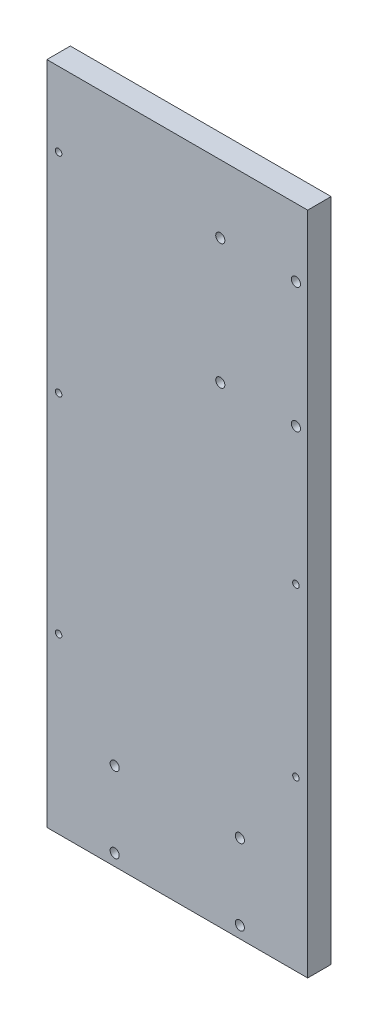
ISO-10303-21;
HEADER;
FILE_DESCRIPTION(('STEP AP214'),'2;1');
FILE_NAME('part.step','',(''),(''),'','','');
FILE_SCHEMA(('AUTOMOTIVE_DESIGN { 1 0 10303 214 1 1 1 1 }'));
ENDSEC;
DATA;
#1=APPLICATION_CONTEXT('core data for automotive mechanical design processes');
#2=APPLICATION_PROTOCOL_DEFINITION('international standard','automotive_design',2000,#1);
#3=PRODUCT_CONTEXT('',#1,'mechanical');
#4=PRODUCT('Part','Part','',(#3));
#5=PRODUCT_RELATED_PRODUCT_CATEGORY('part','',(#4));
#6=PRODUCT_DEFINITION_FORMATION('','',#4);
#7=PRODUCT_DEFINITION_CONTEXT('part definition',#1,'design');
#8=PRODUCT_DEFINITION('design','',#6,#7);
#9=PRODUCT_DEFINITION_SHAPE('','',#8);
#10=(LENGTH_UNIT() NAMED_UNIT(*) SI_UNIT(.MILLI.,.METRE.));
#11=(NAMED_UNIT(*) PLANE_ANGLE_UNIT() SI_UNIT($,.RADIAN.));
#12=(NAMED_UNIT(*) SI_UNIT($,.STERADIAN.) SOLID_ANGLE_UNIT());
#13=UNCERTAINTY_MEASURE_WITH_UNIT(LENGTH_MEASURE(1.E-05),#10,'distance_accuracy_value','');
#14=(GEOMETRIC_REPRESENTATION_CONTEXT(3) GLOBAL_UNCERTAINTY_ASSIGNED_CONTEXT((#13)) GLOBAL_UNIT_ASSIGNED_CONTEXT((#10,
#11,#12)) REPRESENTATION_CONTEXT('',''));
#15=CARTESIAN_POINT('',(0.,0.,0.));
#16=DIRECTION('',(0.,0.,1.));
#17=DIRECTION('',(1.,0.,0.));
#18=AXIS2_PLACEMENT_3D('',#15,#16,#17);
#19=CARTESIAN_POINT('',(100.,255.,18.));
#20=DIRECTION('',(-1.,0.,0.));
#21=DIRECTION('',(0.,-1.,0.));
#22=AXIS2_PLACEMENT_3D('',#19,#20,#21);
#23=PLANE('',#22);
#24=DIRECTION('',(0.,1.,0.));
#25=VECTOR('',#24,1.);
#26=CARTESIAN_POINT('',(100.,255.,0.));
#27=LINE('',#26,#25);
#28=CARTESIAN_POINT('',(100.,-255.,0.));
#29=VERTEX_POINT('',#28);
#30=CARTESIAN_POINT('',(100.,255.,0.));
#31=VERTEX_POINT('',#30);
#32=EDGE_CURVE('E95',#29,#31,#27,.T.);
#33=ORIENTED_EDGE('',*,*,#32,.T.);
#34=DIRECTION('',(0.,0.,-1.));
#35=VECTOR('',#34,1.);
#36=CARTESIAN_POINT('',(100.,255.,18.));
#37=LINE('',#36,#35);
#38=CARTESIAN_POINT('',(100.,255.,18.));
#39=VERTEX_POINT('',#38);
#40=EDGE_CURVE('E11',#39,#31,#37,.T.);
#41=ORIENTED_EDGE('',*,*,#40,.F.);
#42=DIRECTION('',(0.,1.,0.));
#43=VECTOR('',#42,1.);
#44=CARTESIAN_POINT('',(100.,255.,18.));
#45=LINE('',#44,#43);
#46=CARTESIAN_POINT('',(100.,-255.,18.));
#47=VERTEX_POINT('',#46);
#48=EDGE_CURVE('E83',#47,#39,#45,.T.);
#49=ORIENTED_EDGE('',*,*,#48,.F.);
#50=DIRECTION('',(0.,0.,-1.));
#51=VECTOR('',#50,1.);
#52=CARTESIAN_POINT('',(100.,-255.,18.));
#53=LINE('',#52,#51);
#54=EDGE_CURVE('E91',#47,#29,#53,.T.);
#55=ORIENTED_EDGE('',*,*,#54,.T.);
#56=EDGE_LOOP('',(#33,#41,#49,#55));
#57=FACE_BOUND('',#56,.T.);
#58=ADVANCED_FACE('F32',(#57),#23,.F.);
#59=CARTESIAN_POINT('',(-100.,255.,18.));
#60=DIRECTION('',(0.,-1.,0.));
#61=DIRECTION('',(0.,0.,-1.));
#62=AXIS2_PLACEMENT_3D('',#59,#60,#61);
#63=PLANE('',#62);
#64=DIRECTION('',(-1.,0.,0.));
#65=VECTOR('',#64,1.);
#66=CARTESIAN_POINT('',(-100.,255.,0.));
#67=LINE('',#66,#65);
#68=CARTESIAN_POINT('',(-100.,255.,0.));
#69=VERTEX_POINT('',#68);
#70=EDGE_CURVE('E87',#31,#69,#67,.T.);
#71=ORIENTED_EDGE('',*,*,#70,.T.);
#72=DIRECTION('',(0.,0.,-1.));
#73=VECTOR('',#72,1.);
#74=CARTESIAN_POINT('',(-100.,255.,18.));
#75=LINE('',#74,#73);
#76=CARTESIAN_POINT('',(-100.,255.,18.));
#77=VERTEX_POINT('',#76);
#78=EDGE_CURVE('E40',#77,#69,#75,.T.);
#79=ORIENTED_EDGE('',*,*,#78,.F.);
#80=DIRECTION('',(-1.,0.,0.));
#81=VECTOR('',#80,1.);
#82=CARTESIAN_POINT('',(-100.,255.,18.));
#83=LINE('',#82,#81);
#84=EDGE_CURVE('E78',#39,#77,#83,.T.);
#85=ORIENTED_EDGE('',*,*,#84,.F.);
#86=ORIENTED_EDGE('',*,*,#40,.T.);
#87=EDGE_LOOP('',(#71,#79,#85,#86));
#88=FACE_BOUND('',#87,.T.);
#89=ADVANCED_FACE('F86',(#88),#63,.F.);
#90=CARTESIAN_POINT('',(-100.,255.,18.));
#91=DIRECTION('',(1.,0.,0.));
#92=DIRECTION('',(0.,1.,0.));
#93=AXIS2_PLACEMENT_3D('',#90,#91,#92);
#94=PLANE('',#93);
#95=DIRECTION('',(0.,-1.,0.));
#96=VECTOR('',#95,1.);
#97=CARTESIAN_POINT('',(-100.,255.,0.));
#98=LINE('',#97,#96);
#99=CARTESIAN_POINT('',(-99.9999999999999,-255.,0.));
#100=VERTEX_POINT('',#99);
#101=EDGE_CURVE('E65',#69,#100,#98,.T.);
#102=ORIENTED_EDGE('',*,*,#101,.T.);
#103=DIRECTION('',(0.,0.,-1.));
#104=VECTOR('',#103,1.);
#105=CARTESIAN_POINT('',(-99.9999999999999,-255.,18.));
#106=LINE('',#105,#104);
#107=CARTESIAN_POINT('',(-99.9999999999999,-255.,18.));
#108=VERTEX_POINT('',#107);
#109=EDGE_CURVE('E88',#108,#100,#106,.T.);
#110=ORIENTED_EDGE('',*,*,#109,.F.);
#111=DIRECTION('',(0.,-1.,0.));
#112=VECTOR('',#111,1.);
#113=CARTESIAN_POINT('',(-100.,255.,18.));
#114=LINE('',#113,#112);
#115=EDGE_CURVE('E81',#77,#108,#114,.T.);
#116=ORIENTED_EDGE('',*,*,#115,.F.);
#117=ORIENTED_EDGE('',*,*,#78,.T.);
#118=EDGE_LOOP('',(#102,#110,#116,#117));
#119=FACE_BOUND('',#118,.T.);
#120=ADVANCED_FACE('F89',(#119),#94,.F.);
#121=CARTESIAN_POINT('',(-99.9999999999999,-255.,18.));
#122=DIRECTION('',(0.,1.,0.));
#123=DIRECTION('',(0.,0.,1.));
#124=AXIS2_PLACEMENT_3D('',#121,#122,#123);
#125=PLANE('',#124);
#126=DIRECTION('',(1.,0.,0.));
#127=VECTOR('',#126,1.);
#128=CARTESIAN_POINT('',(-99.9999999999999,-255.,0.));
#129=LINE('',#128,#127);
#130=EDGE_CURVE('E71',#100,#29,#129,.T.);
#131=ORIENTED_EDGE('',*,*,#130,.T.);
#132=ORIENTED_EDGE('',*,*,#54,.F.);
#133=DIRECTION('',(1.,0.,0.));
#134=VECTOR('',#133,1.);
#135=CARTESIAN_POINT('',(-99.9999999999999,-255.,18.));
#136=LINE('',#135,#134);
#137=EDGE_CURVE('E48',#108,#47,#136,.T.);
#138=ORIENTED_EDGE('',*,*,#137,.F.);
#139=ORIENTED_EDGE('',*,*,#109,.T.);
#140=EDGE_LOOP('',(#131,#132,#138,#139));
#141=FACE_BOUND('',#140,.T.);
#142=ADVANCED_FACE('F103',(#141),#125,.F.);
#143=CARTESIAN_POINT('',(0.,0.,18.));
#144=DIRECTION('',(0.,0.,1.));
#145=DIRECTION('',(1.,0.,0.));
#146=AXIS2_PLACEMENT_3D('',#143,#144,#145);
#147=PLANE('',#146);
#148=CARTESIAN_POINT('',(48.0000000000004,-187.999999999999,18.));
#149=DIRECTION('',(0.,0.,1.));
#150=DIRECTION('',(1.,0.,0.));
#151=AXIS2_PLACEMENT_3D('',#148,#149,#150);
#152=CIRCLE('',#151,3.5);
#153=CARTESIAN_POINT('',(51.5000000000004,-187.999999999999,18.));
#154=VERTEX_POINT('',#153);
#155=EDGE_CURVE('E183',#154,#154,#152,.T.);
#156=ORIENTED_EDGE('',*,*,#155,.F.);
#157=EDGE_LOOP('',(#156));
#158=FACE_BOUND('',#157,.T.);
#159=CARTESIAN_POINT('',(-47.9999999999996,-187.999999999999,18.));
#160=DIRECTION('',(0.,0.,1.));
#161=DIRECTION('',(1.,0.,0.));
#162=AXIS2_PLACEMENT_3D('',#159,#160,#161);
#163=CIRCLE('',#162,3.5);
#164=CARTESIAN_POINT('',(-44.4999999999996,-187.999999999999,18.));
#165=VERTEX_POINT('',#164);
#166=EDGE_CURVE('E177',#165,#165,#163,.T.);
#167=ORIENTED_EDGE('',*,*,#166,.F.);
#168=EDGE_LOOP('',(#167));
#169=FACE_BOUND('',#168,.T.);
#170=CARTESIAN_POINT('',(48.0000000000003,-246.,18.));
#171=DIRECTION('',(0.,0.,1.));
#172=DIRECTION('',(1.,0.,0.));
#173=AXIS2_PLACEMENT_3D('',#170,#171,#172);
#174=CIRCLE('',#173,3.5);
#175=CARTESIAN_POINT('',(51.5000000000003,-246.,18.));
#176=VERTEX_POINT('',#175);
#177=EDGE_CURVE('E171',#176,#176,#174,.T.);
#178=ORIENTED_EDGE('',*,*,#177,.F.);
#179=EDGE_LOOP('',(#178));
#180=FACE_BOUND('',#179,.T.);
#181=CARTESIAN_POINT('',(-47.9999999999997,-246.,18.));
#182=DIRECTION('',(0.,0.,1.));
#183=DIRECTION('',(1.,0.,0.));
#184=AXIS2_PLACEMENT_3D('',#181,#182,#183);
#185=CIRCLE('',#184,3.5);
#186=CARTESIAN_POINT('',(-44.4999999999997,-246.,18.));
#187=VERTEX_POINT('',#186);
#188=EDGE_CURVE('E165',#187,#187,#185,.T.);
#189=ORIENTED_EDGE('',*,*,#188,.F.);
#190=EDGE_LOOP('',(#189));
#191=FACE_BOUND('',#190,.T.);
#192=CARTESIAN_POINT('',(91.,2.00000000000056,18.));
#193=DIRECTION('',(0.,0.,1.));
#194=DIRECTION('',(1.,0.,0.));
#195=AXIS2_PLACEMENT_3D('',#192,#193,#194);
#196=CIRCLE('',#195,2.49999999999999);
#197=CARTESIAN_POINT('',(93.5,2.00000000000056,18.));
#198=VERTEX_POINT('',#197);
#199=EDGE_CURVE('E159',#198,#198,#196,.T.);
#200=ORIENTED_EDGE('',*,*,#199,.F.);
#201=EDGE_LOOP('',(#200));
#202=FACE_BOUND('',#201,.T.);
#203=CARTESIAN_POINT('',(91.,-125.999999999999,18.));
#204=DIRECTION('',(0.,0.,1.));
#205=DIRECTION('',(1.,0.,0.));
#206=AXIS2_PLACEMENT_3D('',#203,#204,#205);
#207=CIRCLE('',#206,2.49999999999999);
#208=CARTESIAN_POINT('',(93.5,-125.999999999999,18.));
#209=VERTEX_POINT('',#208);
#210=EDGE_CURVE('E153',#209,#209,#207,.T.);
#211=ORIENTED_EDGE('',*,*,#210,.F.);
#212=EDGE_LOOP('',(#211));
#213=FACE_BOUND('',#212,.T.);
#214=CARTESIAN_POINT('',(-91.,198.,18.));
#215=DIRECTION('',(0.,0.,1.));
#216=DIRECTION('',(1.,0.,0.));
#217=AXIS2_PLACEMENT_3D('',#214,#215,#216);
#218=CIRCLE('',#217,2.49999999999999);
#219=CARTESIAN_POINT('',(-88.5000000000001,198.,18.));
#220=VERTEX_POINT('',#219);
#221=EDGE_CURVE('E147',#220,#220,#218,.T.);
#222=ORIENTED_EDGE('',*,*,#221,.F.);
#223=EDGE_LOOP('',(#222));
#224=FACE_BOUND('',#223,.T.);
#225=CARTESIAN_POINT('',(-91.0000000000001,37.9999999999998,18.));
#226=DIRECTION('',(0.,0.,1.));
#227=DIRECTION('',(1.,0.,0.));
#228=AXIS2_PLACEMENT_3D('',#225,#226,#227);
#229=CIRCLE('',#228,2.49999999999999);
#230=CARTESIAN_POINT('',(-88.5000000000001,37.9999999999998,18.));
#231=VERTEX_POINT('',#230);
#232=EDGE_CURVE('E141',#231,#231,#229,.T.);
#233=ORIENTED_EDGE('',*,*,#232,.F.);
#234=EDGE_LOOP('',(#233));
#235=FACE_BOUND('',#234,.T.);
#236=CARTESIAN_POINT('',(-91.,-122.,18.));
#237=DIRECTION('',(0.,0.,1.));
#238=DIRECTION('',(1.,0.,0.));
#239=AXIS2_PLACEMENT_3D('',#236,#237,#238);
#240=CIRCLE('',#239,2.49999999999999);
#241=CARTESIAN_POINT('',(-88.5000000000001,-122.,18.));
#242=VERTEX_POINT('',#241);
#243=EDGE_CURVE('E135',#242,#242,#240,.T.);
#244=ORIENTED_EDGE('',*,*,#243,.F.);
#245=EDGE_LOOP('',(#244));
#246=FACE_BOUND('',#245,.T.);
#247=CARTESIAN_POINT('',(32.9999999999998,203.,18.));
#248=DIRECTION('',(0.,0.,1.));
#249=DIRECTION('',(1.,0.,0.));
#250=AXIS2_PLACEMENT_3D('',#247,#248,#249);
#251=CIRCLE('',#250,3.49999999999999);
#252=CARTESIAN_POINT('',(36.4999999999998,203.,18.));
#253=VERTEX_POINT('',#252);
#254=EDGE_CURVE('E129',#253,#253,#251,.T.);
#255=ORIENTED_EDGE('',*,*,#254,.F.);
#256=EDGE_LOOP('',(#255));
#257=FACE_BOUND('',#256,.T.);
#258=CARTESIAN_POINT('',(32.9999999999998,107.,18.));
#259=DIRECTION('',(0.,0.,1.));
#260=DIRECTION('',(1.,0.,0.));
#261=AXIS2_PLACEMENT_3D('',#258,#259,#260);
#262=CIRCLE('',#261,3.49999999999999);
#263=CARTESIAN_POINT('',(36.4999999999998,107.,18.));
#264=VERTEX_POINT('',#263);
#265=EDGE_CURVE('E123',#264,#264,#262,.T.);
#266=ORIENTED_EDGE('',*,*,#265,.F.);
#267=EDGE_LOOP('',(#266));
#268=FACE_BOUND('',#267,.T.);
#269=CARTESIAN_POINT('',(91.,203.,18.));
#270=DIRECTION('',(0.,0.,1.));
#271=DIRECTION('',(1.,0.,0.));
#272=AXIS2_PLACEMENT_3D('',#269,#270,#271);
#273=CIRCLE('',#272,3.49999999999999);
#274=CARTESIAN_POINT('',(94.5,203.,18.));
#275=VERTEX_POINT('',#274);
#276=EDGE_CURVE('E117',#275,#275,#273,.T.);
#277=ORIENTED_EDGE('',*,*,#276,.F.);
#278=EDGE_LOOP('',(#277));
#279=FACE_BOUND('',#278,.T.);
#280=CARTESIAN_POINT('',(91.,107.,18.));
#281=DIRECTION('',(0.,0.,1.));
#282=DIRECTION('',(1.,0.,0.));
#283=AXIS2_PLACEMENT_3D('',#280,#281,#282);
#284=CIRCLE('',#283,3.49999999999999);
#285=CARTESIAN_POINT('',(94.5,107.,18.));
#286=VERTEX_POINT('',#285);
#287=EDGE_CURVE('E111',#286,#286,#284,.T.);
#288=ORIENTED_EDGE('',*,*,#287,.F.);
#289=EDGE_LOOP('',(#288));
#290=FACE_BOUND('',#289,.T.);
#291=ORIENTED_EDGE('',*,*,#48,.T.);
#292=ORIENTED_EDGE('',*,*,#84,.T.);
#293=ORIENTED_EDGE('',*,*,#115,.T.);
#294=ORIENTED_EDGE('',*,*,#137,.T.);
#295=EDGE_LOOP('',(#291,#292,#293,#294));
#296=FACE_BOUND('',#295,.T.);
#297=ADVANCED_FACE('F79',(#158,#169,#180,#191,#202,#213,#224,#235,#246,#257,#268,#279,#290,
#296),#147,.T.);
#298=CARTESIAN_POINT('',(0.,0.,0.));
#299=DIRECTION('',(0.,0.,1.));
#300=DIRECTION('',(1.,0.,0.));
#301=AXIS2_PLACEMENT_3D('',#298,#299,#300);
#302=PLANE('',#301);
#303=CARTESIAN_POINT('',(48.0000000000004,-187.999999999999,0.));
#304=DIRECTION('',(0.,0.,1.));
#305=DIRECTION('',(1.,0.,0.));
#306=AXIS2_PLACEMENT_3D('',#303,#304,#305);
#307=CIRCLE('',#306,3.5);
#308=CARTESIAN_POINT('',(51.5000000000004,-187.999999999999,0.));
#309=VERTEX_POINT('',#308);
#310=EDGE_CURVE('E180',#309,#309,#307,.T.);
#311=ORIENTED_EDGE('',*,*,#310,.T.);
#312=EDGE_LOOP('',(#311));
#313=FACE_BOUND('',#312,.T.);
#314=CARTESIAN_POINT('',(-47.9999999999996,-187.999999999999,0.));
#315=DIRECTION('',(0.,0.,1.));
#316=DIRECTION('',(1.,0.,0.));
#317=AXIS2_PLACEMENT_3D('',#314,#315,#316);
#318=CIRCLE('',#317,3.5);
#319=CARTESIAN_POINT('',(-44.4999999999996,-187.999999999999,0.));
#320=VERTEX_POINT('',#319);
#321=EDGE_CURVE('E174',#320,#320,#318,.T.);
#322=ORIENTED_EDGE('',*,*,#321,.T.);
#323=EDGE_LOOP('',(#322));
#324=FACE_BOUND('',#323,.T.);
#325=CARTESIAN_POINT('',(48.0000000000003,-246.,0.));
#326=DIRECTION('',(0.,0.,1.));
#327=DIRECTION('',(1.,0.,0.));
#328=AXIS2_PLACEMENT_3D('',#325,#326,#327);
#329=CIRCLE('',#328,3.5);
#330=CARTESIAN_POINT('',(51.5000000000003,-246.,0.));
#331=VERTEX_POINT('',#330);
#332=EDGE_CURVE('E168',#331,#331,#329,.T.);
#333=ORIENTED_EDGE('',*,*,#332,.T.);
#334=EDGE_LOOP('',(#333));
#335=FACE_BOUND('',#334,.T.);
#336=CARTESIAN_POINT('',(-47.9999999999997,-246.,0.));
#337=DIRECTION('',(0.,0.,1.));
#338=DIRECTION('',(1.,0.,0.));
#339=AXIS2_PLACEMENT_3D('',#336,#337,#338);
#340=CIRCLE('',#339,3.5);
#341=CARTESIAN_POINT('',(-44.4999999999997,-246.,0.));
#342=VERTEX_POINT('',#341);
#343=EDGE_CURVE('E162',#342,#342,#340,.T.);
#344=ORIENTED_EDGE('',*,*,#343,.T.);
#345=EDGE_LOOP('',(#344));
#346=FACE_BOUND('',#345,.T.);
#347=CARTESIAN_POINT('',(91.,2.00000000000056,0.));
#348=DIRECTION('',(0.,0.,1.));
#349=DIRECTION('',(1.,0.,0.));
#350=AXIS2_PLACEMENT_3D('',#347,#348,#349);
#351=CIRCLE('',#350,2.49999999999999);
#352=CARTESIAN_POINT('',(93.5,2.00000000000056,0.));
#353=VERTEX_POINT('',#352);
#354=EDGE_CURVE('E156',#353,#353,#351,.T.);
#355=ORIENTED_EDGE('',*,*,#354,.T.);
#356=EDGE_LOOP('',(#355));
#357=FACE_BOUND('',#356,.T.);
#358=CARTESIAN_POINT('',(91.,-125.999999999999,0.));
#359=DIRECTION('',(0.,0.,1.));
#360=DIRECTION('',(1.,0.,0.));
#361=AXIS2_PLACEMENT_3D('',#358,#359,#360);
#362=CIRCLE('',#361,2.49999999999999);
#363=CARTESIAN_POINT('',(93.5,-125.999999999999,0.));
#364=VERTEX_POINT('',#363);
#365=EDGE_CURVE('E150',#364,#364,#362,.T.);
#366=ORIENTED_EDGE('',*,*,#365,.T.);
#367=EDGE_LOOP('',(#366));
#368=FACE_BOUND('',#367,.T.);
#369=CARTESIAN_POINT('',(-91.,198.,0.));
#370=DIRECTION('',(0.,0.,1.));
#371=DIRECTION('',(1.,0.,0.));
#372=AXIS2_PLACEMENT_3D('',#369,#370,#371);
#373=CIRCLE('',#372,2.49999999999999);
#374=CARTESIAN_POINT('',(-88.5000000000001,198.,0.));
#375=VERTEX_POINT('',#374);
#376=EDGE_CURVE('E144',#375,#375,#373,.T.);
#377=ORIENTED_EDGE('',*,*,#376,.T.);
#378=EDGE_LOOP('',(#377));
#379=FACE_BOUND('',#378,.T.);
#380=CARTESIAN_POINT('',(-91.0000000000001,37.9999999999998,0.));
#381=DIRECTION('',(0.,0.,1.));
#382=DIRECTION('',(1.,0.,0.));
#383=AXIS2_PLACEMENT_3D('',#380,#381,#382);
#384=CIRCLE('',#383,2.49999999999999);
#385=CARTESIAN_POINT('',(-88.5000000000001,37.9999999999998,0.));
#386=VERTEX_POINT('',#385);
#387=EDGE_CURVE('E138',#386,#386,#384,.T.);
#388=ORIENTED_EDGE('',*,*,#387,.T.);
#389=EDGE_LOOP('',(#388));
#390=FACE_BOUND('',#389,.T.);
#391=CARTESIAN_POINT('',(-91.,-122.,0.));
#392=DIRECTION('',(0.,0.,1.));
#393=DIRECTION('',(1.,0.,0.));
#394=AXIS2_PLACEMENT_3D('',#391,#392,#393);
#395=CIRCLE('',#394,2.49999999999999);
#396=CARTESIAN_POINT('',(-88.5000000000001,-122.,0.));
#397=VERTEX_POINT('',#396);
#398=EDGE_CURVE('E132',#397,#397,#395,.T.);
#399=ORIENTED_EDGE('',*,*,#398,.T.);
#400=EDGE_LOOP('',(#399));
#401=FACE_BOUND('',#400,.T.);
#402=CARTESIAN_POINT('',(32.9999999999998,203.,0.));
#403=DIRECTION('',(0.,0.,1.));
#404=DIRECTION('',(1.,0.,0.));
#405=AXIS2_PLACEMENT_3D('',#402,#403,#404);
#406=CIRCLE('',#405,3.5);
#407=CARTESIAN_POINT('',(36.4999999999998,203.,0.));
#408=VERTEX_POINT('',#407);
#409=EDGE_CURVE('E126',#408,#408,#406,.T.);
#410=ORIENTED_EDGE('',*,*,#409,.T.);
#411=EDGE_LOOP('',(#410));
#412=FACE_BOUND('',#411,.T.);
#413=CARTESIAN_POINT('',(32.9999999999998,107.,0.));
#414=DIRECTION('',(0.,0.,1.));
#415=DIRECTION('',(1.,0.,0.));
#416=AXIS2_PLACEMENT_3D('',#413,#414,#415);
#417=CIRCLE('',#416,3.5);
#418=CARTESIAN_POINT('',(36.4999999999998,107.,0.));
#419=VERTEX_POINT('',#418);
#420=EDGE_CURVE('E120',#419,#419,#417,.T.);
#421=ORIENTED_EDGE('',*,*,#420,.T.);
#422=EDGE_LOOP('',(#421));
#423=FACE_BOUND('',#422,.T.);
#424=CARTESIAN_POINT('',(91.,203.,0.));
#425=DIRECTION('',(0.,0.,1.));
#426=DIRECTION('',(1.,0.,0.));
#427=AXIS2_PLACEMENT_3D('',#424,#425,#426);
#428=CIRCLE('',#427,3.49999999999999);
#429=CARTESIAN_POINT('',(94.5,203.,0.));
#430=VERTEX_POINT('',#429);
#431=EDGE_CURVE('E114',#430,#430,#428,.T.);
#432=ORIENTED_EDGE('',*,*,#431,.T.);
#433=EDGE_LOOP('',(#432));
#434=FACE_BOUND('',#433,.T.);
#435=CARTESIAN_POINT('',(91.,107.,0.));
#436=DIRECTION('',(0.,0.,1.));
#437=DIRECTION('',(1.,0.,0.));
#438=AXIS2_PLACEMENT_3D('',#435,#436,#437);
#439=CIRCLE('',#438,3.49999999999999);
#440=CARTESIAN_POINT('',(94.5,107.,0.));
#441=VERTEX_POINT('',#440);
#442=EDGE_CURVE('E98',#441,#441,#439,.T.);
#443=ORIENTED_EDGE('',*,*,#442,.T.);
#444=EDGE_LOOP('',(#443));
#445=FACE_BOUND('',#444,.T.);
#446=ORIENTED_EDGE('',*,*,#32,.F.);
#447=ORIENTED_EDGE('',*,*,#130,.F.);
#448=ORIENTED_EDGE('',*,*,#101,.F.);
#449=ORIENTED_EDGE('',*,*,#70,.F.);
#450=EDGE_LOOP('',(#446,#447,#448,#449));
#451=FACE_BOUND('',#450,.T.);
#452=ADVANCED_FACE('F106',(#313,#324,#335,#346,#357,#368,#379,#390,#401,#412,#423,#434,#445,
#451),#302,.F.);
#453=CARTESIAN_POINT('',(91.,107.,18.));
#454=DIRECTION('',(0.,0.,1.));
#455=DIRECTION('',(1.,0.,0.));
#456=AXIS2_PLACEMENT_3D('',#453,#454,#455);
#457=CYLINDRICAL_SURFACE('',#456,3.49999999999999);
#458=ORIENTED_EDGE('',*,*,#442,.F.);
#459=EDGE_LOOP('',(#458));
#460=FACE_BOUND('',#459,.T.);
#461=ORIENTED_EDGE('',*,*,#287,.T.);
#462=EDGE_LOOP('',(#461));
#463=FACE_BOUND('',#462,.T.);
#464=ADVANCED_FACE('F216',(#460,#463),#457,.F.);
#465=CARTESIAN_POINT('',(91.,203.,18.));
#466=DIRECTION('',(0.,0.,1.));
#467=DIRECTION('',(1.,0.,0.));
#468=AXIS2_PLACEMENT_3D('',#465,#466,#467);
#469=CYLINDRICAL_SURFACE('',#468,3.49999999999999);
#470=ORIENTED_EDGE('',*,*,#431,.F.);
#471=EDGE_LOOP('',(#470));
#472=FACE_BOUND('',#471,.T.);
#473=ORIENTED_EDGE('',*,*,#276,.T.);
#474=EDGE_LOOP('',(#473));
#475=FACE_BOUND('',#474,.T.);
#476=ADVANCED_FACE('F218',(#472,#475),#469,.F.);
#477=CARTESIAN_POINT('',(32.9999999999998,107.,18.));
#478=DIRECTION('',(0.,0.,1.));
#479=DIRECTION('',(1.,0.,0.));
#480=AXIS2_PLACEMENT_3D('',#477,#478,#479);
#481=CYLINDRICAL_SURFACE('',#480,3.49999999999999);
#482=ORIENTED_EDGE('',*,*,#420,.F.);
#483=EDGE_LOOP('',(#482));
#484=FACE_BOUND('',#483,.T.);
#485=ORIENTED_EDGE('',*,*,#265,.T.);
#486=EDGE_LOOP('',(#485));
#487=FACE_BOUND('',#486,.T.);
#488=ADVANCED_FACE('F225',(#484,#487),#481,.F.);
#489=CARTESIAN_POINT('',(32.9999999999998,203.,18.));
#490=DIRECTION('',(0.,0.,1.));
#491=DIRECTION('',(1.,0.,0.));
#492=AXIS2_PLACEMENT_3D('',#489,#490,#491);
#493=CYLINDRICAL_SURFACE('',#492,3.49999999999999);
#494=ORIENTED_EDGE('',*,*,#409,.F.);
#495=EDGE_LOOP('',(#494));
#496=FACE_BOUND('',#495,.T.);
#497=ORIENTED_EDGE('',*,*,#254,.T.);
#498=EDGE_LOOP('',(#497));
#499=FACE_BOUND('',#498,.T.);
#500=ADVANCED_FACE('F320',(#496,#499),#493,.F.);
#501=CARTESIAN_POINT('',(-91.,-122.,18.));
#502=DIRECTION('',(0.,0.,1.));
#503=DIRECTION('',(1.,0.,0.));
#504=AXIS2_PLACEMENT_3D('',#501,#502,#503);
#505=CYLINDRICAL_SURFACE('',#504,2.49999999999999);
#506=ORIENTED_EDGE('',*,*,#398,.F.);
#507=EDGE_LOOP('',(#506));
#508=FACE_BOUND('',#507,.T.);
#509=ORIENTED_EDGE('',*,*,#243,.T.);
#510=EDGE_LOOP('',(#509));
#511=FACE_BOUND('',#510,.T.);
#512=ADVANCED_FACE('F316',(#508,#511),#505,.F.);
#513=CARTESIAN_POINT('',(-91.0000000000001,37.9999999999998,18.));
#514=DIRECTION('',(0.,0.,1.));
#515=DIRECTION('',(1.,0.,0.));
#516=AXIS2_PLACEMENT_3D('',#513,#514,#515);
#517=CYLINDRICAL_SURFACE('',#516,2.49999999999999);
#518=ORIENTED_EDGE('',*,*,#387,.F.);
#519=EDGE_LOOP('',(#518));
#520=FACE_BOUND('',#519,.T.);
#521=ORIENTED_EDGE('',*,*,#232,.T.);
#522=EDGE_LOOP('',(#521));
#523=FACE_BOUND('',#522,.T.);
#524=ADVANCED_FACE('F312',(#520,#523),#517,.F.);
#525=CARTESIAN_POINT('',(-91.,198.,18.));
#526=DIRECTION('',(0.,0.,1.));
#527=DIRECTION('',(1.,0.,0.));
#528=AXIS2_PLACEMENT_3D('',#525,#526,#527);
#529=CYLINDRICAL_SURFACE('',#528,2.49999999999999);
#530=ORIENTED_EDGE('',*,*,#376,.F.);
#531=EDGE_LOOP('',(#530));
#532=FACE_BOUND('',#531,.T.);
#533=ORIENTED_EDGE('',*,*,#221,.T.);
#534=EDGE_LOOP('',(#533));
#535=FACE_BOUND('',#534,.T.);
#536=ADVANCED_FACE('F308',(#532,#535),#529,.F.);
#537=CARTESIAN_POINT('',(91.,-125.999999999999,18.));
#538=DIRECTION('',(0.,0.,1.));
#539=DIRECTION('',(1.,0.,0.));
#540=AXIS2_PLACEMENT_3D('',#537,#538,#539);
#541=CYLINDRICAL_SURFACE('',#540,2.49999999999999);
#542=ORIENTED_EDGE('',*,*,#365,.F.);
#543=EDGE_LOOP('',(#542));
#544=FACE_BOUND('',#543,.T.);
#545=ORIENTED_EDGE('',*,*,#210,.T.);
#546=EDGE_LOOP('',(#545));
#547=FACE_BOUND('',#546,.T.);
#548=ADVANCED_FACE('F304',(#544,#547),#541,.F.);
#549=CARTESIAN_POINT('',(91.,2.00000000000056,18.));
#550=DIRECTION('',(0.,0.,1.));
#551=DIRECTION('',(1.,0.,0.));
#552=AXIS2_PLACEMENT_3D('',#549,#550,#551);
#553=CYLINDRICAL_SURFACE('',#552,2.49999999999999);
#554=ORIENTED_EDGE('',*,*,#354,.F.);
#555=EDGE_LOOP('',(#554));
#556=FACE_BOUND('',#555,.T.);
#557=ORIENTED_EDGE('',*,*,#199,.T.);
#558=EDGE_LOOP('',(#557));
#559=FACE_BOUND('',#558,.T.);
#560=ADVANCED_FACE('F266',(#556,#559),#553,.F.);
#561=CARTESIAN_POINT('',(-47.9999999999997,-246.,18.));
#562=DIRECTION('',(0.,0.,1.));
#563=DIRECTION('',(1.,0.,0.));
#564=AXIS2_PLACEMENT_3D('',#561,#562,#563);
#565=CYLINDRICAL_SURFACE('',#564,3.5);
#566=ORIENTED_EDGE('',*,*,#343,.F.);
#567=EDGE_LOOP('',(#566));
#568=FACE_BOUND('',#567,.T.);
#569=ORIENTED_EDGE('',*,*,#188,.T.);
#570=EDGE_LOOP('',(#569));
#571=FACE_BOUND('',#570,.T.);
#572=ADVANCED_FACE('F260',(#568,#571),#565,.F.);
#573=CARTESIAN_POINT('',(48.0000000000003,-246.,18.));
#574=DIRECTION('',(0.,0.,1.));
#575=DIRECTION('',(1.,0.,0.));
#576=AXIS2_PLACEMENT_3D('',#573,#574,#575);
#577=CYLINDRICAL_SURFACE('',#576,3.5);
#578=ORIENTED_EDGE('',*,*,#332,.F.);
#579=EDGE_LOOP('',(#578));
#580=FACE_BOUND('',#579,.T.);
#581=ORIENTED_EDGE('',*,*,#177,.T.);
#582=EDGE_LOOP('',(#581));
#583=FACE_BOUND('',#582,.T.);
#584=ADVANCED_FACE('F265',(#580,#583),#577,.F.);
#585=CARTESIAN_POINT('',(-47.9999999999996,-187.999999999999,18.));
#586=DIRECTION('',(0.,0.,1.));
#587=DIRECTION('',(1.,0.,0.));
#588=AXIS2_PLACEMENT_3D('',#585,#586,#587);
#589=CYLINDRICAL_SURFACE('',#588,3.5);
#590=ORIENTED_EDGE('',*,*,#321,.F.);
#591=EDGE_LOOP('',(#590));
#592=FACE_BOUND('',#591,.T.);
#593=ORIENTED_EDGE('',*,*,#166,.T.);
#594=EDGE_LOOP('',(#593));
#595=FACE_BOUND('',#594,.T.);
#596=ADVANCED_FACE('F278',(#592,#595),#589,.F.);
#597=CARTESIAN_POINT('',(48.0000000000004,-187.999999999999,18.));
#598=DIRECTION('',(0.,0.,1.));
#599=DIRECTION('',(1.,0.,0.));
#600=AXIS2_PLACEMENT_3D('',#597,#598,#599);
#601=CYLINDRICAL_SURFACE('',#600,3.5);
#602=ORIENTED_EDGE('',*,*,#310,.F.);
#603=EDGE_LOOP('',(#602));
#604=FACE_BOUND('',#603,.T.);
#605=ORIENTED_EDGE('',*,*,#155,.T.);
#606=EDGE_LOOP('',(#605));
#607=FACE_BOUND('',#606,.T.);
#608=ADVANCED_FACE('F187',(#604,#607),#601,.F.);
#609=CLOSED_SHELL('',(#58,#89,#120,#142,#297,#452,#464,#476,#488,#500,#512,#524,#536,#548,#560,
#572,#584,#596,#608));
#610=MANIFOLD_SOLID_BREP('B2',#609);
#611=ADVANCED_BREP_SHAPE_REPRESENTATION('',(#18,#610),#14);
#612=SHAPE_DEFINITION_REPRESENTATION(#9,#611);
ENDSEC;
END-ISO-10303-21;
